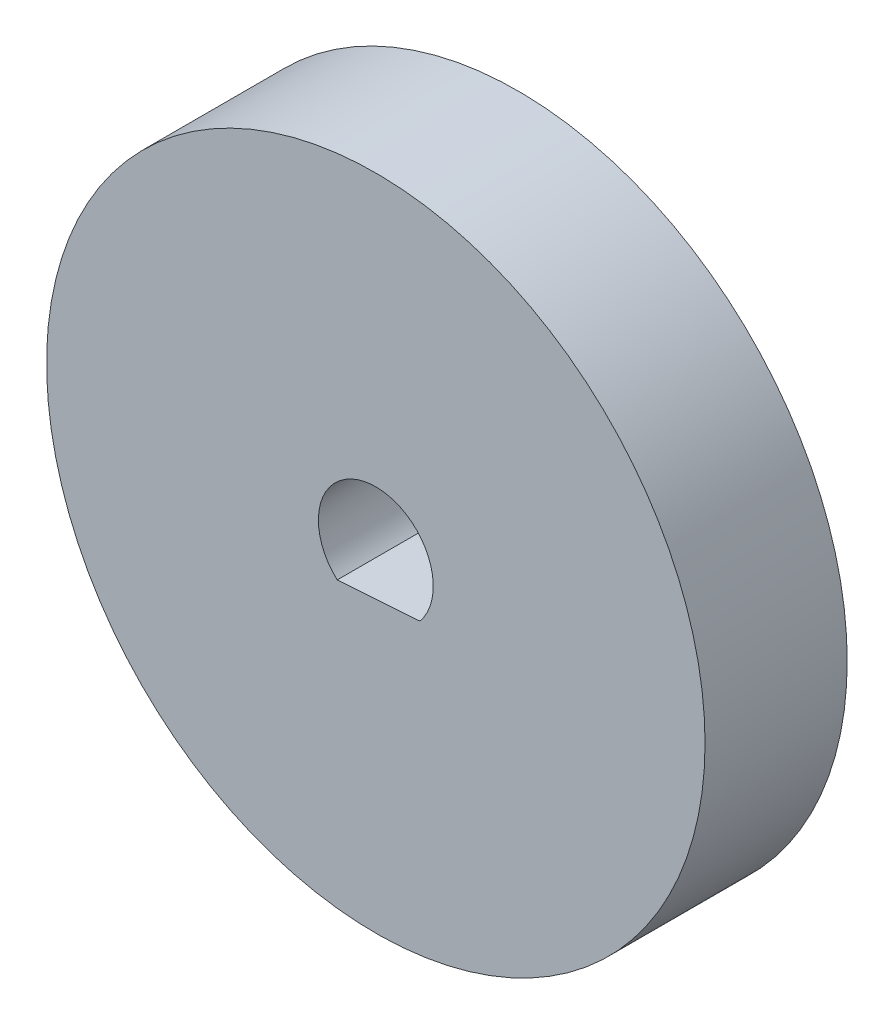
ISO-10303-21;
HEADER;
FILE_DESCRIPTION(('STEP AP214'),'2;1');
FILE_NAME('part.step','',(''),(''),'','','');
FILE_SCHEMA(('AUTOMOTIVE_DESIGN { 1 0 10303 214 1 1 1 1 }'));
ENDSEC;
DATA;
#1=APPLICATION_CONTEXT('core data for automotive mechanical design processes');
#2=APPLICATION_PROTOCOL_DEFINITION('international standard','automotive_design',2000,#1);
#3=PRODUCT_CONTEXT('',#1,'mechanical');
#4=PRODUCT('Part','Part','',(#3));
#5=PRODUCT_RELATED_PRODUCT_CATEGORY('part','',(#4));
#6=PRODUCT_DEFINITION_FORMATION('','',#4);
#7=PRODUCT_DEFINITION_CONTEXT('part definition',#1,'design');
#8=PRODUCT_DEFINITION('design','',#6,#7);
#9=PRODUCT_DEFINITION_SHAPE('','',#8);
#10=(LENGTH_UNIT() NAMED_UNIT(*) SI_UNIT(.MILLI.,.METRE.));
#11=(NAMED_UNIT(*) PLANE_ANGLE_UNIT() SI_UNIT($,.RADIAN.));
#12=(NAMED_UNIT(*) SI_UNIT($,.STERADIAN.) SOLID_ANGLE_UNIT());
#13=UNCERTAINTY_MEASURE_WITH_UNIT(LENGTH_MEASURE(1.E-05),#10,'distance_accuracy_value','');
#14=(GEOMETRIC_REPRESENTATION_CONTEXT(3) GLOBAL_UNCERTAINTY_ASSIGNED_CONTEXT((#13)) GLOBAL_UNIT_ASSIGNED_CONTEXT((#10,
#11,#12)) REPRESENTATION_CONTEXT('',''));
#15=CARTESIAN_POINT('',(0.,0.,0.));
#16=DIRECTION('',(0.,0.,1.));
#17=DIRECTION('',(1.,0.,0.));
#18=AXIS2_PLACEMENT_3D('',#15,#16,#17);
#19=CARTESIAN_POINT('',(0.,7.28960820003668,4.826));
#20=DIRECTION('',(0.,0.,-1.));
#21=DIRECTION('',(-1.,0.,0.));
#22=AXIS2_PLACEMENT_3D('',#19,#20,#21);
#23=CYLINDRICAL_SURFACE('',#22,11.176);
#24=CARTESIAN_POINT('',(0.,7.28960820003668,4.826));
#25=DIRECTION('',(0.,0.,1.));
#26=DIRECTION('',(1.,0.,0.));
#27=AXIS2_PLACEMENT_3D('',#24,#25,#26);
#28=CIRCLE('',#27,11.176);
#29=CARTESIAN_POINT('',(11.176,7.28960820003668,4.826));
#30=VERTEX_POINT('',#29);
#31=EDGE_CURVE('E11',#30,#30,#28,.T.);
#32=ORIENTED_EDGE('',*,*,#31,.F.);
#33=EDGE_LOOP('',(#32));
#34=FACE_BOUND('',#33,.T.);
#35=CARTESIAN_POINT('',(0.,7.28960820003668,0.));
#36=DIRECTION('',(0.,0.,1.));
#37=DIRECTION('',(1.,0.,0.));
#38=AXIS2_PLACEMENT_3D('',#35,#36,#37);
#39=CIRCLE('',#38,11.176);
#40=CARTESIAN_POINT('',(11.176,7.28960820003668,0.));
#41=VERTEX_POINT('',#40);
#42=EDGE_CURVE('E36',#41,#41,#39,.T.);
#43=ORIENTED_EDGE('',*,*,#42,.T.);
#44=EDGE_LOOP('',(#43));
#45=FACE_BOUND('',#44,.T.);
#46=ADVANCED_FACE('F33',(#34,#45),#23,.T.);
#47=CARTESIAN_POINT('',(0.,7.28960820003668,4.826));
#48=DIRECTION('',(0.,0.,1.));
#49=DIRECTION('',(1.,0.,0.));
#50=AXIS2_PLACEMENT_3D('',#47,#48,#49);
#51=PLANE('',#50);
#52=DIRECTION('',(-0.997623607863514,-0.0688994704869773,0.));
#53=VECTOR('',#52,1.);
#54=CARTESIAN_POINT('',(-0.408042316587414,5.90821156037567,4.826));
#55=LINE('',#54,#53);
#56=CARTESIAN_POINT('',(1.4967951329659,6.03976647808562,4.826));
#57=VERTEX_POINT('',#56);
#58=CARTESIAN_POINT('',(-1.31076656265106,5.84586618075625,4.826));
#59=VERTEX_POINT('',#58);
#60=EDGE_CURVE('E47',#57,#59,#55,.T.);
#61=ORIENTED_EDGE('',*,*,#60,.T.);
#62=CARTESIAN_POINT('',(0.,7.28960820003668,4.826));
#63=DIRECTION('',(0.,0.,-1.));
#64=DIRECTION('',(-1.,0.,0.));
#65=AXIS2_PLACEMENT_3D('',#62,#63,#64);
#66=CIRCLE('',#65,1.95);
#67=EDGE_CURVE('E74',#59,#57,#66,.T.);
#68=ORIENTED_EDGE('',*,*,#67,.T.);
#69=EDGE_LOOP('',(#61,#68));
#70=FACE_BOUND('',#69,.T.);
#71=ORIENTED_EDGE('',*,*,#31,.T.);
#72=EDGE_LOOP('',(#71));
#73=FACE_BOUND('',#72,.T.);
#74=ADVANCED_FACE('F78',(#70,#73),#51,.T.);
#75=CARTESIAN_POINT('',(0.,7.28960820003668,0.));
#76=DIRECTION('',(0.,0.,1.));
#77=DIRECTION('',(1.,0.,0.));
#78=AXIS2_PLACEMENT_3D('',#75,#76,#77);
#79=PLANE('',#78);
#80=CARTESIAN_POINT('',(0.,7.28960820003668,0.));
#81=DIRECTION('',(0.,0.,-1.));
#82=DIRECTION('',(-1.,0.,0.));
#83=AXIS2_PLACEMENT_3D('',#80,#81,#82);
#84=CIRCLE('',#83,1.95);
#85=CARTESIAN_POINT('',(-1.31076656265106,5.84586618075625,0.));
#86=VERTEX_POINT('',#85);
#87=CARTESIAN_POINT('',(1.4967951329659,6.03976647808562,0.));
#88=VERTEX_POINT('',#87);
#89=EDGE_CURVE('E66',#86,#88,#84,.T.);
#90=ORIENTED_EDGE('',*,*,#89,.F.);
#91=DIRECTION('',(-0.997623607863514,-0.0688994704869773,0.));
#92=VECTOR('',#91,1.);
#93=CARTESIAN_POINT('',(-0.408042316587414,5.90821156037567,0.));
#94=LINE('',#93,#92);
#95=EDGE_CURVE('E52',#88,#86,#94,.T.);
#96=ORIENTED_EDGE('',*,*,#95,.F.);
#97=EDGE_LOOP('',(#90,#96));
#98=FACE_BOUND('',#97,.T.);
#99=ORIENTED_EDGE('',*,*,#42,.F.);
#100=EDGE_LOOP('',(#99));
#101=FACE_BOUND('',#100,.T.);
#102=ADVANCED_FACE('F70',(#98,#101),#79,.F.);
#103=CARTESIAN_POINT('',(-0.408042316587414,5.90821156037567,4.826));
#104=DIRECTION('',(0.0688994704869773,-0.997623607863514,0.));
#105=DIRECTION('',(0.997623607863514,0.0688994704869773,0.));
#106=AXIS2_PLACEMENT_3D('',#103,#104,#105);
#107=PLANE('',#106);
#108=ORIENTED_EDGE('',*,*,#95,.T.);
#109=DIRECTION('',(0.,0.,-1.));
#110=VECTOR('',#109,1.);
#111=CARTESIAN_POINT('',(-1.31076656265106,5.84586618075625,4.826));
#112=LINE('',#111,#110);
#113=EDGE_CURVE('E63',#59,#86,#112,.T.);
#114=ORIENTED_EDGE('',*,*,#113,.F.);
#115=ORIENTED_EDGE('',*,*,#60,.F.);
#116=DIRECTION('',(0.,0.,-1.));
#117=VECTOR('',#116,1.);
#118=CARTESIAN_POINT('',(1.4967951329659,6.03976647808562,4.826));
#119=LINE('',#118,#117);
#120=EDGE_CURVE('E57',#57,#88,#119,.T.);
#121=ORIENTED_EDGE('',*,*,#120,.T.);
#122=EDGE_LOOP('',(#108,#114,#115,#121));
#123=FACE_BOUND('',#122,.T.);
#124=ADVANCED_FACE('F59',(#123),#107,.F.);
#125=CARTESIAN_POINT('',(0.,7.28960820003668,4.826));
#126=DIRECTION('',(0.,0.,-1.));
#127=DIRECTION('',(-1.,0.,0.));
#128=AXIS2_PLACEMENT_3D('',#125,#126,#127);
#129=CYLINDRICAL_SURFACE('',#128,1.95);
#130=ORIENTED_EDGE('',*,*,#89,.T.);
#131=ORIENTED_EDGE('',*,*,#120,.F.);
#132=ORIENTED_EDGE('',*,*,#67,.F.);
#133=ORIENTED_EDGE('',*,*,#113,.T.);
#134=EDGE_LOOP('',(#130,#131,#132,#133));
#135=FACE_BOUND('',#134,.T.);
#136=ADVANCED_FACE('F67',(#135),#129,.F.);
#137=CLOSED_SHELL('',(#46,#74,#102,#124,#136));
#138=MANIFOLD_SOLID_BREP('B2',#137);
#139=ADVANCED_BREP_SHAPE_REPRESENTATION('',(#18,#138),#14);
#140=SHAPE_DEFINITION_REPRESENTATION(#9,#139);
ENDSEC;
END-ISO-10303-21;
